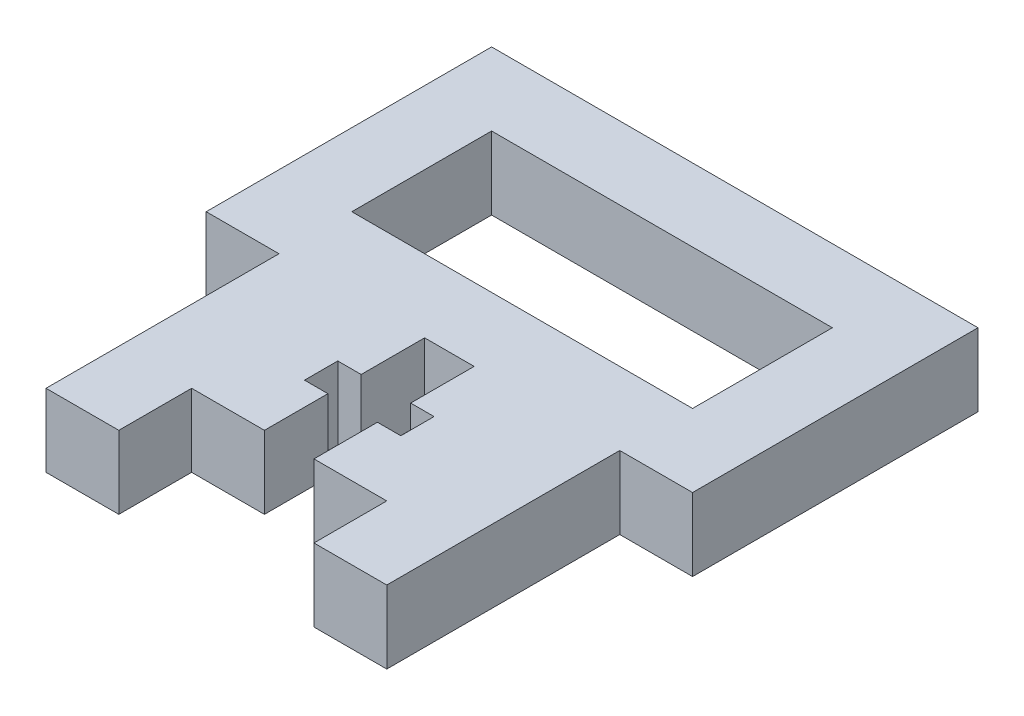
ISO-10303-21;
HEADER;
FILE_DESCRIPTION(('STEP AP214'),'2;1');
FILE_NAME('part.step','',(''),(''),'','','');
FILE_SCHEMA(('AUTOMOTIVE_DESIGN { 1 0 10303 214 1 1 1 1 }'));
ENDSEC;
DATA;
#1=APPLICATION_CONTEXT('core data for automotive mechanical design processes');
#2=APPLICATION_PROTOCOL_DEFINITION('international standard','automotive_design',2000,#1);
#3=PRODUCT_CONTEXT('',#1,'mechanical');
#4=PRODUCT('Part','Part','',(#3));
#5=PRODUCT_RELATED_PRODUCT_CATEGORY('part','',(#4));
#6=PRODUCT_DEFINITION_FORMATION('','',#4);
#7=PRODUCT_DEFINITION_CONTEXT('part definition',#1,'design');
#8=PRODUCT_DEFINITION('design','',#6,#7);
#9=PRODUCT_DEFINITION_SHAPE('','',#8);
#10=(LENGTH_UNIT() NAMED_UNIT(*) SI_UNIT(.MILLI.,.METRE.));
#11=(NAMED_UNIT(*) PLANE_ANGLE_UNIT() SI_UNIT($,.RADIAN.));
#12=(NAMED_UNIT(*) SI_UNIT($,.STERADIAN.) SOLID_ANGLE_UNIT());
#13=UNCERTAINTY_MEASURE_WITH_UNIT(LENGTH_MEASURE(1.E-05),#10,'distance_accuracy_value','');
#14=(GEOMETRIC_REPRESENTATION_CONTEXT(3) GLOBAL_UNCERTAINTY_ASSIGNED_CONTEXT((#13)) GLOBAL_UNIT_ASSIGNED_CONTEXT((#10,
#11,#12)) REPRESENTATION_CONTEXT('',''));
#15=CARTESIAN_POINT('',(0.,0.,0.));
#16=DIRECTION('',(0.,0.,1.));
#17=DIRECTION('',(1.,0.,0.));
#18=AXIS2_PLACEMENT_3D('',#15,#16,#17);
#19=CARTESIAN_POINT('',(0.,6.35,26.416));
#20=DIRECTION('',(0.,0.,1.));
#21=DIRECTION('',(1.,0.,0.));
#22=AXIS2_PLACEMENT_3D('',#19,#20,#21);
#23=PLANE('',#22);
#24=DIRECTION('',(-1.,0.,0.));
#25=VECTOR('',#24,1.);
#26=CARTESIAN_POINT('',(0.,0.,26.416));
#27=LINE('',#26,#25);
#28=CARTESIAN_POINT('',(8.509,0.,26.416));
#29=VERTEX_POINT('',#28);
#30=CARTESIAN_POINT('',(2.159,0.,26.416));
#31=VERTEX_POINT('',#30);
#32=EDGE_CURVE('E383',#29,#31,#27,.T.);
#33=ORIENTED_EDGE('',*,*,#32,.F.);
#34=DIRECTION('',(0.,-1.,0.));
#35=VECTOR('',#34,1.);
#36=CARTESIAN_POINT('',(8.509,6.35,26.416));
#37=LINE('',#36,#35);
#38=CARTESIAN_POINT('',(8.509,6.35,26.416));
#39=VERTEX_POINT('',#38);
#40=EDGE_CURVE('E11',#39,#29,#37,.T.);
#41=ORIENTED_EDGE('',*,*,#40,.F.);
#42=DIRECTION('',(-1.,0.,0.));
#43=VECTOR('',#42,1.);
#44=CARTESIAN_POINT('',(0.,6.35,26.416));
#45=LINE('',#44,#43);
#46=CARTESIAN_POINT('',(2.159,6.35,26.416));
#47=VERTEX_POINT('',#46);
#48=EDGE_CURVE('E453',#39,#47,#45,.T.);
#49=ORIENTED_EDGE('',*,*,#48,.T.);
#50=DIRECTION('',(0.,-1.,0.));
#51=VECTOR('',#50,1.);
#52=CARTESIAN_POINT('',(2.159,6.35,26.416));
#53=LINE('',#52,#51);
#54=EDGE_CURVE('E148',#47,#31,#53,.T.);
#55=ORIENTED_EDGE('',*,*,#54,.T.);
#56=EDGE_LOOP('',(#33,#41,#49,#55));
#57=FACE_BOUND('',#56,.T.);
#58=ADVANCED_FACE('F35',(#57),#23,.T.);
#59=CARTESIAN_POINT('',(8.50900000000001,6.35,0.));
#60=DIRECTION('',(1.,0.,0.));
#61=DIRECTION('',(0.,0.,-1.));
#62=AXIS2_PLACEMENT_3D('',#59,#60,#61);
#63=PLANE('',#62);
#64=DIRECTION('',(0.,0.,1.));
#65=VECTOR('',#64,1.);
#66=CARTESIAN_POINT('',(8.50900000000001,0.,0.));
#67=LINE('',#66,#65);
#68=CARTESIAN_POINT('',(8.509,0.,32.766));
#69=VERTEX_POINT('',#68);
#70=EDGE_CURVE('E380',#29,#69,#67,.T.);
#71=ORIENTED_EDGE('',*,*,#70,.T.);
#72=DIRECTION('',(0.,-1.,0.));
#73=VECTOR('',#72,1.);
#74=CARTESIAN_POINT('',(8.509,6.35,32.766));
#75=LINE('',#74,#73);
#76=CARTESIAN_POINT('',(8.509,6.35,32.766));
#77=VERTEX_POINT('',#76);
#78=EDGE_CURVE('E45',#77,#69,#75,.T.);
#79=ORIENTED_EDGE('',*,*,#78,.F.);
#80=DIRECTION('',(0.,0.,1.));
#81=VECTOR('',#80,1.);
#82=CARTESIAN_POINT('',(8.50900000000001,6.35,0.));
#83=LINE('',#82,#81);
#84=EDGE_CURVE('E450',#39,#77,#83,.T.);
#85=ORIENTED_EDGE('',*,*,#84,.F.);
#86=ORIENTED_EDGE('',*,*,#40,.T.);
#87=EDGE_LOOP('',(#71,#79,#85,#86));
#88=FACE_BOUND('',#87,.T.);
#89=ADVANCED_FACE('F479',(#88),#63,.F.);
#90=CARTESIAN_POINT('',(0.,6.35,32.766));
#91=DIRECTION('',(0.,0.,-1.));
#92=DIRECTION('',(-1.,0.,0.));
#93=AXIS2_PLACEMENT_3D('',#90,#91,#92);
#94=PLANE('',#93);
#95=DIRECTION('',(1.,0.,0.));
#96=VECTOR('',#95,1.);
#97=CARTESIAN_POINT('',(0.,0.,32.766));
#98=LINE('',#97,#96);
#99=CARTESIAN_POINT('',(14.859,0.,32.766));
#100=VERTEX_POINT('',#99);
#101=EDGE_CURVE('E377',#69,#100,#98,.T.);
#102=ORIENTED_EDGE('',*,*,#101,.T.);
#103=DIRECTION('',(0.,-1.,0.));
#104=VECTOR('',#103,1.);
#105=CARTESIAN_POINT('',(14.859,6.35,32.766));
#106=LINE('',#105,#104);
#107=CARTESIAN_POINT('',(14.859,6.35,32.766));
#108=VERTEX_POINT('',#107);
#109=EDGE_CURVE('E301',#108,#100,#106,.T.);
#110=ORIENTED_EDGE('',*,*,#109,.F.);
#111=DIRECTION('',(1.,0.,0.));
#112=VECTOR('',#111,1.);
#113=CARTESIAN_POINT('',(0.,6.35,32.766));
#114=LINE('',#113,#112);
#115=EDGE_CURVE('E447',#77,#108,#114,.T.);
#116=ORIENTED_EDGE('',*,*,#115,.F.);
#117=ORIENTED_EDGE('',*,*,#78,.T.);
#118=EDGE_LOOP('',(#102,#110,#116,#117));
#119=FACE_BOUND('',#118,.T.);
#120=ADVANCED_FACE('F483',(#119),#94,.F.);
#121=CARTESIAN_POINT('',(14.859,6.35,0.));
#122=DIRECTION('',(-1.,0.,0.));
#123=DIRECTION('',(0.,0.,1.));
#124=AXIS2_PLACEMENT_3D('',#121,#122,#123);
#125=PLANE('',#124);
#126=DIRECTION('',(0.,0.,-1.));
#127=VECTOR('',#126,1.);
#128=CARTESIAN_POINT('',(14.859,0.,0.));
#129=LINE('',#128,#127);
#130=CARTESIAN_POINT('',(14.859,0.,12.446));
#131=VERTEX_POINT('',#130);
#132=EDGE_CURVE('E374',#100,#131,#129,.T.);
#133=ORIENTED_EDGE('',*,*,#132,.T.);
#134=DIRECTION('',(0.,-1.,0.));
#135=VECTOR('',#134,1.);
#136=CARTESIAN_POINT('',(14.859,6.35,12.446));
#137=LINE('',#136,#135);
#138=CARTESIAN_POINT('',(14.859,6.35,12.446));
#139=VERTEX_POINT('',#138);
#140=EDGE_CURVE('E298',#139,#131,#137,.T.);
#141=ORIENTED_EDGE('',*,*,#140,.F.);
#142=DIRECTION('',(0.,0.,-1.));
#143=VECTOR('',#142,1.);
#144=CARTESIAN_POINT('',(14.859,6.35,0.));
#145=LINE('',#144,#143);
#146=EDGE_CURVE('E444',#108,#139,#145,.T.);
#147=ORIENTED_EDGE('',*,*,#146,.F.);
#148=ORIENTED_EDGE('',*,*,#109,.T.);
#149=EDGE_LOOP('',(#133,#141,#147,#148));
#150=FACE_BOUND('',#149,.T.);
#151=ADVANCED_FACE('F485',(#150),#125,.F.);
#152=CARTESIAN_POINT('',(0.,6.35,12.446));
#153=DIRECTION('',(0.,0.,-1.));
#154=DIRECTION('',(-1.,0.,0.));
#155=AXIS2_PLACEMENT_3D('',#152,#153,#154);
#156=PLANE('',#155);
#157=DIRECTION('',(1.,0.,0.));
#158=VECTOR('',#157,1.);
#159=CARTESIAN_POINT('',(0.,0.,12.446));
#160=LINE('',#159,#158);
#161=CARTESIAN_POINT('',(21.209,0.,12.446));
#162=VERTEX_POINT('',#161);
#163=EDGE_CURVE('E371',#131,#162,#160,.T.);
#164=ORIENTED_EDGE('',*,*,#163,.T.);
#165=DIRECTION('',(0.,-1.,0.));
#166=VECTOR('',#165,1.);
#167=CARTESIAN_POINT('',(21.209,6.35,12.446));
#168=LINE('',#167,#166);
#169=CARTESIAN_POINT('',(21.209,6.35,12.446));
#170=VERTEX_POINT('',#169);
#171=EDGE_CURVE('E295',#170,#162,#168,.T.);
#172=ORIENTED_EDGE('',*,*,#171,.F.);
#173=DIRECTION('',(1.,0.,0.));
#174=VECTOR('',#173,1.);
#175=CARTESIAN_POINT('',(0.,6.35,12.446));
#176=LINE('',#175,#174);
#177=EDGE_CURVE('E441',#139,#170,#176,.T.);
#178=ORIENTED_EDGE('',*,*,#177,.F.);
#179=ORIENTED_EDGE('',*,*,#140,.T.);
#180=EDGE_LOOP('',(#164,#172,#178,#179));
#181=FACE_BOUND('',#180,.T.);
#182=ADVANCED_FACE('F487',(#181),#156,.F.);
#183=CARTESIAN_POINT('',(21.209,6.35,0.));
#184=DIRECTION('',(-1.,0.,0.));
#185=DIRECTION('',(0.,0.,1.));
#186=AXIS2_PLACEMENT_3D('',#183,#184,#185);
#187=PLANE('',#186);
#188=DIRECTION('',(0.,0.,-1.));
#189=VECTOR('',#188,1.);
#190=CARTESIAN_POINT('',(21.209,0.,0.));
#191=LINE('',#190,#189);
#192=CARTESIAN_POINT('',(21.209,0.,-12.446));
#193=VERTEX_POINT('',#192);
#194=EDGE_CURVE('E368',#162,#193,#191,.T.);
#195=ORIENTED_EDGE('',*,*,#194,.T.);
#196=DIRECTION('',(0.,-1.,0.));
#197=VECTOR('',#196,1.);
#198=CARTESIAN_POINT('',(21.209,6.35,-12.446));
#199=LINE('',#198,#197);
#200=CARTESIAN_POINT('',(21.209,6.35,-12.446));
#201=VERTEX_POINT('',#200);
#202=EDGE_CURVE('E293',#201,#193,#199,.T.);
#203=ORIENTED_EDGE('',*,*,#202,.F.);
#204=DIRECTION('',(0.,0.,-1.));
#205=VECTOR('',#204,1.);
#206=CARTESIAN_POINT('',(21.209,6.35,0.));
#207=LINE('',#206,#205);
#208=EDGE_CURVE('E439',#170,#201,#207,.T.);
#209=ORIENTED_EDGE('',*,*,#208,.F.);
#210=ORIENTED_EDGE('',*,*,#171,.T.);
#211=EDGE_LOOP('',(#195,#203,#209,#210));
#212=FACE_BOUND('',#211,.T.);
#213=ADVANCED_FACE('F493',(#212),#187,.F.);
#214=CARTESIAN_POINT('',(0.,6.35,-12.446));
#215=DIRECTION('',(0.,0.,-1.));
#216=DIRECTION('',(-1.,0.,0.));
#217=AXIS2_PLACEMENT_3D('',#214,#215,#216);
#218=PLANE('',#217);
#219=DIRECTION('',(1.,0.,0.));
#220=VECTOR('',#219,1.);
#221=CARTESIAN_POINT('',(0.,0.,-12.446));
#222=LINE('',#221,#220);
#223=CARTESIAN_POINT('',(-21.209,0.,-12.446));
#224=VERTEX_POINT('',#223);
#225=EDGE_CURVE('E365',#224,#193,#222,.T.);
#226=ORIENTED_EDGE('',*,*,#225,.F.);
#227=DIRECTION('',(0.,-1.,0.));
#228=VECTOR('',#227,1.);
#229=CARTESIAN_POINT('',(-21.209,6.35,-12.446));
#230=LINE('',#229,#228);
#231=CARTESIAN_POINT('',(-21.209,6.35,-12.446));
#232=VERTEX_POINT('',#231);
#233=EDGE_CURVE('E291',#232,#224,#230,.T.);
#234=ORIENTED_EDGE('',*,*,#233,.F.);
#235=DIRECTION('',(1.,0.,0.));
#236=VECTOR('',#235,1.);
#237=CARTESIAN_POINT('',(0.,6.35,-12.446));
#238=LINE('',#237,#236);
#239=EDGE_CURVE('E436',#232,#201,#238,.T.);
#240=ORIENTED_EDGE('',*,*,#239,.T.);
#241=ORIENTED_EDGE('',*,*,#202,.T.);
#242=EDGE_LOOP('',(#226,#234,#240,#241));
#243=FACE_BOUND('',#242,.T.);
#244=ADVANCED_FACE('F496',(#243),#218,.T.);
#245=CARTESIAN_POINT('',(-21.209,6.35,0.));
#246=DIRECTION('',(-1.,0.,0.));
#247=DIRECTION('',(0.,0.,1.));
#248=AXIS2_PLACEMENT_3D('',#245,#246,#247);
#249=PLANE('',#248);
#250=DIRECTION('',(0.,0.,-1.));
#251=VECTOR('',#250,1.);
#252=CARTESIAN_POINT('',(-21.209,0.,0.));
#253=LINE('',#252,#251);
#254=CARTESIAN_POINT('',(-21.209,0.,12.446));
#255=VERTEX_POINT('',#254);
#256=EDGE_CURVE('E362',#255,#224,#253,.T.);
#257=ORIENTED_EDGE('',*,*,#256,.F.);
#258=DIRECTION('',(0.,-1.,0.));
#259=VECTOR('',#258,1.);
#260=CARTESIAN_POINT('',(-21.209,6.35,12.446));
#261=LINE('',#260,#259);
#262=CARTESIAN_POINT('',(-21.209,6.35,12.446));
#263=VERTEX_POINT('',#262);
#264=EDGE_CURVE('E289',#263,#255,#261,.T.);
#265=ORIENTED_EDGE('',*,*,#264,.F.);
#266=DIRECTION('',(0.,0.,-1.));
#267=VECTOR('',#266,1.);
#268=CARTESIAN_POINT('',(-21.209,6.35,0.));
#269=LINE('',#268,#267);
#270=EDGE_CURVE('E433',#263,#232,#269,.T.);
#271=ORIENTED_EDGE('',*,*,#270,.T.);
#272=ORIENTED_EDGE('',*,*,#233,.T.);
#273=EDGE_LOOP('',(#257,#265,#271,#272));
#274=FACE_BOUND('',#273,.T.);
#275=ADVANCED_FACE('F499',(#274),#249,.T.);
#276=CARTESIAN_POINT('',(0.,6.35,12.446));
#277=DIRECTION('',(0.,0.,1.));
#278=DIRECTION('',(1.,0.,0.));
#279=AXIS2_PLACEMENT_3D('',#276,#277,#278);
#280=PLANE('',#279);
#281=DIRECTION('',(-1.,0.,0.));
#282=VECTOR('',#281,1.);
#283=CARTESIAN_POINT('',(0.,0.,12.446));
#284=LINE('',#283,#282);
#285=CARTESIAN_POINT('',(-14.859,0.,12.446));
#286=VERTEX_POINT('',#285);
#287=EDGE_CURVE('E359',#286,#255,#284,.T.);
#288=ORIENTED_EDGE('',*,*,#287,.F.);
#289=DIRECTION('',(0.,-1.,0.));
#290=VECTOR('',#289,1.);
#291=CARTESIAN_POINT('',(-14.859,6.35,12.446));
#292=LINE('',#291,#290);
#293=CARTESIAN_POINT('',(-14.859,6.35,12.446));
#294=VERTEX_POINT('',#293);
#295=EDGE_CURVE('E287',#294,#286,#292,.T.);
#296=ORIENTED_EDGE('',*,*,#295,.F.);
#297=DIRECTION('',(-1.,0.,0.));
#298=VECTOR('',#297,1.);
#299=CARTESIAN_POINT('',(0.,6.35,12.446));
#300=LINE('',#299,#298);
#301=EDGE_CURVE('E430',#294,#263,#300,.T.);
#302=ORIENTED_EDGE('',*,*,#301,.T.);
#303=ORIENTED_EDGE('',*,*,#264,.T.);
#304=EDGE_LOOP('',(#288,#296,#302,#303));
#305=FACE_BOUND('',#304,.T.);
#306=ADVANCED_FACE('F504',(#305),#280,.T.);
#307=CARTESIAN_POINT('',(-14.859,6.35,0.));
#308=DIRECTION('',(-1.,0.,0.));
#309=DIRECTION('',(0.,0.,1.));
#310=AXIS2_PLACEMENT_3D('',#307,#308,#309);
#311=PLANE('',#310);
#312=DIRECTION('',(0.,0.,-1.));
#313=VECTOR('',#312,1.);
#314=CARTESIAN_POINT('',(-14.859,0.,0.));
#315=LINE('',#314,#313);
#316=CARTESIAN_POINT('',(-14.859,0.,32.766));
#317=VERTEX_POINT('',#316);
#318=EDGE_CURVE('E356',#317,#286,#315,.T.);
#319=ORIENTED_EDGE('',*,*,#318,.F.);
#320=DIRECTION('',(0.,-1.,0.));
#321=VECTOR('',#320,1.);
#322=CARTESIAN_POINT('',(-14.859,6.35,32.766));
#323=LINE('',#322,#321);
#324=CARTESIAN_POINT('',(-14.859,6.35,32.766));
#325=VERTEX_POINT('',#324);
#326=EDGE_CURVE('E285',#325,#317,#323,.T.);
#327=ORIENTED_EDGE('',*,*,#326,.F.);
#328=DIRECTION('',(0.,0.,-1.));
#329=VECTOR('',#328,1.);
#330=CARTESIAN_POINT('',(-14.859,6.35,0.));
#331=LINE('',#330,#329);
#332=EDGE_CURVE('E427',#325,#294,#331,.T.);
#333=ORIENTED_EDGE('',*,*,#332,.T.);
#334=ORIENTED_EDGE('',*,*,#295,.T.);
#335=EDGE_LOOP('',(#319,#327,#333,#334));
#336=FACE_BOUND('',#335,.T.);
#337=ADVANCED_FACE('F507',(#336),#311,.T.);
#338=CARTESIAN_POINT('',(0.,6.35,32.766));
#339=DIRECTION('',(0.,0.,1.));
#340=DIRECTION('',(1.,0.,0.));
#341=AXIS2_PLACEMENT_3D('',#338,#339,#340);
#342=PLANE('',#341);
#343=DIRECTION('',(-1.,0.,0.));
#344=VECTOR('',#343,1.);
#345=CARTESIAN_POINT('',(0.,0.,32.766));
#346=LINE('',#345,#344);
#347=CARTESIAN_POINT('',(-8.50899999999999,0.,32.766));
#348=VERTEX_POINT('',#347);
#349=EDGE_CURVE('E353',#348,#317,#346,.T.);
#350=ORIENTED_EDGE('',*,*,#349,.F.);
#351=DIRECTION('',(0.,-1.,0.));
#352=VECTOR('',#351,1.);
#353=CARTESIAN_POINT('',(-8.50899999999999,6.35,32.766));
#354=LINE('',#353,#352);
#355=CARTESIAN_POINT('',(-8.50899999999999,6.35,32.766));
#356=VERTEX_POINT('',#355);
#357=EDGE_CURVE('E283',#356,#348,#354,.T.);
#358=ORIENTED_EDGE('',*,*,#357,.F.);
#359=DIRECTION('',(-1.,0.,0.));
#360=VECTOR('',#359,1.);
#361=CARTESIAN_POINT('',(0.,6.35,32.766));
#362=LINE('',#361,#360);
#363=EDGE_CURVE('E424',#356,#325,#362,.T.);
#364=ORIENTED_EDGE('',*,*,#363,.T.);
#365=ORIENTED_EDGE('',*,*,#326,.T.);
#366=EDGE_LOOP('',(#350,#358,#364,#365));
#367=FACE_BOUND('',#366,.T.);
#368=ADVANCED_FACE('F512',(#367),#342,.T.);
#369=CARTESIAN_POINT('',(-8.50900000000001,6.35,0.));
#370=DIRECTION('',(1.,0.,0.));
#371=DIRECTION('',(0.,0.,-1.));
#372=AXIS2_PLACEMENT_3D('',#369,#370,#371);
#373=PLANE('',#372);
#374=DIRECTION('',(0.,0.,1.));
#375=VECTOR('',#374,1.);
#376=CARTESIAN_POINT('',(-8.50900000000001,0.,0.));
#377=LINE('',#376,#375);
#378=CARTESIAN_POINT('',(-8.509,0.,26.416));
#379=VERTEX_POINT('',#378);
#380=EDGE_CURVE('E350',#379,#348,#377,.T.);
#381=ORIENTED_EDGE('',*,*,#380,.F.);
#382=DIRECTION('',(0.,-1.,0.));
#383=VECTOR('',#382,1.);
#384=CARTESIAN_POINT('',(-8.509,6.35,26.416));
#385=LINE('',#384,#383);
#386=CARTESIAN_POINT('',(-8.509,6.35,26.416));
#387=VERTEX_POINT('',#386);
#388=EDGE_CURVE('E281',#387,#379,#385,.T.);
#389=ORIENTED_EDGE('',*,*,#388,.F.);
#390=DIRECTION('',(0.,0.,1.));
#391=VECTOR('',#390,1.);
#392=CARTESIAN_POINT('',(-8.50900000000001,6.35,0.));
#393=LINE('',#392,#391);
#394=EDGE_CURVE('E421',#387,#356,#393,.T.);
#395=ORIENTED_EDGE('',*,*,#394,.T.);
#396=ORIENTED_EDGE('',*,*,#357,.T.);
#397=EDGE_LOOP('',(#381,#389,#395,#396));
#398=FACE_BOUND('',#397,.T.);
#399=ADVANCED_FACE('F515',(#398),#373,.T.);
#400=CARTESIAN_POINT('',(0.,6.35,26.416));
#401=DIRECTION('',(0.,0.,-1.));
#402=DIRECTION('',(-1.,0.,0.));
#403=AXIS2_PLACEMENT_3D('',#400,#401,#402);
#404=PLANE('',#403);
#405=DIRECTION('',(1.,0.,0.));
#406=VECTOR('',#405,1.);
#407=CARTESIAN_POINT('',(0.,0.,26.416));
#408=LINE('',#407,#406);
#409=CARTESIAN_POINT('',(-2.159,0.,26.416));
#410=VERTEX_POINT('',#409);
#411=EDGE_CURVE('E347',#379,#410,#408,.T.);
#412=ORIENTED_EDGE('',*,*,#411,.T.);
#413=DIRECTION('',(0.,-1.,0.));
#414=VECTOR('',#413,1.);
#415=CARTESIAN_POINT('',(-2.159,6.35,26.416));
#416=LINE('',#415,#414);
#417=CARTESIAN_POINT('',(-2.159,6.35,26.416));
#418=VERTEX_POINT('',#417);
#419=EDGE_CURVE('E278',#418,#410,#416,.T.);
#420=ORIENTED_EDGE('',*,*,#419,.F.);
#421=DIRECTION('',(1.,0.,0.));
#422=VECTOR('',#421,1.);
#423=CARTESIAN_POINT('',(0.,6.35,26.416));
#424=LINE('',#423,#422);
#425=EDGE_CURVE('E418',#387,#418,#424,.T.);
#426=ORIENTED_EDGE('',*,*,#425,.F.);
#427=ORIENTED_EDGE('',*,*,#388,.T.);
#428=EDGE_LOOP('',(#412,#420,#426,#427));
#429=FACE_BOUND('',#428,.T.);
#430=ADVANCED_FACE('F520',(#429),#404,.F.);
#431=CARTESIAN_POINT('',(-2.15899999999998,6.35,0.));
#432=DIRECTION('',(-1.,0.,0.));
#433=DIRECTION('',(0.,0.,1.));
#434=AXIS2_PLACEMENT_3D('',#431,#432,#433);
#435=PLANE('',#434);
#436=DIRECTION('',(0.,0.,-1.));
#437=VECTOR('',#436,1.);
#438=CARTESIAN_POINT('',(-2.15899999999998,0.,0.));
#439=LINE('',#438,#437);
#440=CARTESIAN_POINT('',(-2.15899999999999,0.,20.881000021));
#441=VERTEX_POINT('',#440);
#442=EDGE_CURVE('E344',#410,#441,#439,.T.);
#443=ORIENTED_EDGE('',*,*,#442,.T.);
#444=DIRECTION('',(0.,-1.,0.));
#445=VECTOR('',#444,1.);
#446=CARTESIAN_POINT('',(-2.15899999999999,6.35,20.881000021));
#447=LINE('',#446,#445);
#448=CARTESIAN_POINT('',(-2.15899999999999,6.35,20.881000021));
#449=VERTEX_POINT('',#448);
#450=EDGE_CURVE('E275',#449,#441,#447,.T.);
#451=ORIENTED_EDGE('',*,*,#450,.F.);
#452=DIRECTION('',(0.,0.,-1.));
#453=VECTOR('',#452,1.);
#454=CARTESIAN_POINT('',(-2.15899999999998,6.35,0.));
#455=LINE('',#454,#453);
#456=EDGE_CURVE('E415',#418,#449,#455,.T.);
#457=ORIENTED_EDGE('',*,*,#456,.F.);
#458=ORIENTED_EDGE('',*,*,#419,.T.);
#459=EDGE_LOOP('',(#443,#451,#457,#458));
#460=FACE_BOUND('',#459,.T.);
#461=ADVANCED_FACE('F523',(#460),#435,.F.);
#462=CARTESIAN_POINT('',(0.,6.35,20.881000021));
#463=DIRECTION('',(0.,0.,1.));
#464=DIRECTION('',(1.,0.,0.));
#465=AXIS2_PLACEMENT_3D('',#462,#463,#464);
#466=PLANE('',#465);
#467=DIRECTION('',(-1.,0.,0.));
#468=VECTOR('',#467,1.);
#469=CARTESIAN_POINT('',(0.,0.,20.881000021));
#470=LINE('',#469,#468);
#471=CARTESIAN_POINT('',(-4.199999982,0.,20.881000021));
#472=VERTEX_POINT('',#471);
#473=EDGE_CURVE('E341',#441,#472,#470,.T.);
#474=ORIENTED_EDGE('',*,*,#473,.T.);
#475=DIRECTION('',(0.,-1.,0.));
#476=VECTOR('',#475,1.);
#477=CARTESIAN_POINT('',(-4.199999982,6.35,20.881000021));
#478=LINE('',#477,#476);
#479=CARTESIAN_POINT('',(-4.199999982,6.35,20.881000021));
#480=VERTEX_POINT('',#479);
#481=EDGE_CURVE('E272',#480,#472,#478,.T.);
#482=ORIENTED_EDGE('',*,*,#481,.F.);
#483=DIRECTION('',(-1.,0.,0.));
#484=VECTOR('',#483,1.);
#485=CARTESIAN_POINT('',(0.,6.35,20.881000021));
#486=LINE('',#485,#484);
#487=EDGE_CURVE('E412',#449,#480,#486,.T.);
#488=ORIENTED_EDGE('',*,*,#487,.F.);
#489=ORIENTED_EDGE('',*,*,#450,.T.);
#490=EDGE_LOOP('',(#474,#482,#488,#489));
#491=FACE_BOUND('',#490,.T.);
#492=ADVANCED_FACE('F525',(#491),#466,.F.);
#493=CARTESIAN_POINT('',(-4.19999998199997,6.35,0.));
#494=DIRECTION('',(-1.,0.,0.));
#495=DIRECTION('',(0.,0.,1.));
#496=AXIS2_PLACEMENT_3D('',#493,#494,#495);
#497=PLANE('',#496);
#498=DIRECTION('',(0.,0.,-1.));
#499=VECTOR('',#498,1.);
#500=CARTESIAN_POINT('',(-4.19999998199997,0.,0.));
#501=LINE('',#500,#499);
#502=CARTESIAN_POINT('',(-4.19999998199999,0.,17.980999979));
#503=VERTEX_POINT('',#502);
#504=EDGE_CURVE('E338',#472,#503,#501,.T.);
#505=ORIENTED_EDGE('',*,*,#504,.T.);
#506=DIRECTION('',(0.,-1.,0.));
#507=VECTOR('',#506,1.);
#508=CARTESIAN_POINT('',(-4.19999998199999,6.35,17.980999979));
#509=LINE('',#508,#507);
#510=CARTESIAN_POINT('',(-4.19999998199999,6.35,17.980999979));
#511=VERTEX_POINT('',#510);
#512=EDGE_CURVE('E269',#511,#503,#509,.T.);
#513=ORIENTED_EDGE('',*,*,#512,.F.);
#514=DIRECTION('',(0.,0.,-1.));
#515=VECTOR('',#514,1.);
#516=CARTESIAN_POINT('',(-4.19999998199997,6.35,0.));
#517=LINE('',#516,#515);
#518=EDGE_CURVE('E409',#480,#511,#517,.T.);
#519=ORIENTED_EDGE('',*,*,#518,.F.);
#520=ORIENTED_EDGE('',*,*,#481,.T.);
#521=EDGE_LOOP('',(#505,#513,#519,#520));
#522=FACE_BOUND('',#521,.T.);
#523=ADVANCED_FACE('F530',(#522),#497,.F.);
#524=CARTESIAN_POINT('',(0.,6.35,17.980999979));
#525=DIRECTION('',(0.,0.,-1.));
#526=DIRECTION('',(-1.,0.,0.));
#527=AXIS2_PLACEMENT_3D('',#524,#525,#526);
#528=PLANE('',#527);
#529=DIRECTION('',(1.,0.,0.));
#530=VECTOR('',#529,1.);
#531=CARTESIAN_POINT('',(0.,0.,17.980999979));
#532=LINE('',#531,#530);
#533=CARTESIAN_POINT('',(-2.15899999999999,0.,17.980999979));
#534=VERTEX_POINT('',#533);
#535=EDGE_CURVE('E335',#503,#534,#532,.T.);
#536=ORIENTED_EDGE('',*,*,#535,.T.);
#537=DIRECTION('',(0.,-1.,0.));
#538=VECTOR('',#537,1.);
#539=CARTESIAN_POINT('',(-2.15899999999999,6.35,17.980999979));
#540=LINE('',#539,#538);
#541=CARTESIAN_POINT('',(-2.15899999999999,6.35,17.980999979));
#542=VERTEX_POINT('',#541);
#543=EDGE_CURVE('E266',#542,#534,#540,.T.);
#544=ORIENTED_EDGE('',*,*,#543,.F.);
#545=DIRECTION('',(1.,0.,0.));
#546=VECTOR('',#545,1.);
#547=CARTESIAN_POINT('',(0.,6.35,17.980999979));
#548=LINE('',#547,#546);
#549=EDGE_CURVE('E406',#511,#542,#548,.T.);
#550=ORIENTED_EDGE('',*,*,#549,.F.);
#551=ORIENTED_EDGE('',*,*,#512,.T.);
#552=EDGE_LOOP('',(#536,#544,#550,#551));
#553=FACE_BOUND('',#552,.T.);
#554=ADVANCED_FACE('F532',(#553),#528,.F.);
#555=CARTESIAN_POINT('',(-2.15899999999999,6.35,0.));
#556=DIRECTION('',(-1.,0.,0.));
#557=DIRECTION('',(0.,0.,1.));
#558=AXIS2_PLACEMENT_3D('',#555,#556,#557);
#559=PLANE('',#558);
#560=DIRECTION('',(0.,0.,-1.));
#561=VECTOR('',#560,1.);
#562=CARTESIAN_POINT('',(-2.15899999999999,0.,0.));
#563=LINE('',#562,#561);
#564=CARTESIAN_POINT('',(-2.15899999999999,0.,12.446));
#565=VERTEX_POINT('',#564);
#566=EDGE_CURVE('E332',#534,#565,#563,.T.);
#567=ORIENTED_EDGE('',*,*,#566,.T.);
#568=DIRECTION('',(0.,-1.,0.));
#569=VECTOR('',#568,1.);
#570=CARTESIAN_POINT('',(-2.15899999999999,6.35,12.446));
#571=LINE('',#570,#569);
#572=CARTESIAN_POINT('',(-2.15899999999999,6.35,12.446));
#573=VERTEX_POINT('',#572);
#574=EDGE_CURVE('E263',#573,#565,#571,.T.);
#575=ORIENTED_EDGE('',*,*,#574,.F.);
#576=DIRECTION('',(0.,0.,-1.));
#577=VECTOR('',#576,1.);
#578=CARTESIAN_POINT('',(-2.15899999999999,6.35,0.));
#579=LINE('',#578,#577);
#580=EDGE_CURVE('E403',#542,#573,#579,.T.);
#581=ORIENTED_EDGE('',*,*,#580,.F.);
#582=ORIENTED_EDGE('',*,*,#543,.T.);
#583=EDGE_LOOP('',(#567,#575,#581,#582));
#584=FACE_BOUND('',#583,.T.);
#585=ADVANCED_FACE('F534',(#584),#559,.F.);
#586=CARTESIAN_POINT('',(0.,6.35,12.446));
#587=DIRECTION('',(0.,0.,-1.));
#588=DIRECTION('',(-1.,0.,0.));
#589=AXIS2_PLACEMENT_3D('',#586,#587,#588);
#590=PLANE('',#589);
#591=DIRECTION('',(1.,0.,0.));
#592=VECTOR('',#591,1.);
#593=CARTESIAN_POINT('',(0.,0.,12.446));
#594=LINE('',#593,#592);
#595=CARTESIAN_POINT('',(2.159,0.,12.446));
#596=VERTEX_POINT('',#595);
#597=EDGE_CURVE('E329',#565,#596,#594,.T.);
#598=ORIENTED_EDGE('',*,*,#597,.T.);
#599=DIRECTION('',(0.,-1.,0.));
#600=VECTOR('',#599,1.);
#601=CARTESIAN_POINT('',(2.159,6.35,12.446));
#602=LINE('',#601,#600);
#603=CARTESIAN_POINT('',(2.159,6.35,12.446));
#604=VERTEX_POINT('',#603);
#605=EDGE_CURVE('E260',#604,#596,#602,.T.);
#606=ORIENTED_EDGE('',*,*,#605,.F.);
#607=DIRECTION('',(1.,0.,0.));
#608=VECTOR('',#607,1.);
#609=CARTESIAN_POINT('',(0.,6.35,12.446));
#610=LINE('',#609,#608);
#611=EDGE_CURVE('E400',#573,#604,#610,.T.);
#612=ORIENTED_EDGE('',*,*,#611,.F.);
#613=ORIENTED_EDGE('',*,*,#574,.T.);
#614=EDGE_LOOP('',(#598,#606,#612,#613));
#615=FACE_BOUND('',#614,.T.);
#616=ADVANCED_FACE('F539',(#615),#590,.F.);
#617=CARTESIAN_POINT('',(2.15899999999998,6.35,0.));
#618=DIRECTION('',(1.,0.,0.));
#619=DIRECTION('',(0.,0.,-1.));
#620=AXIS2_PLACEMENT_3D('',#617,#618,#619);
#621=PLANE('',#620);
#622=DIRECTION('',(0.,0.,1.));
#623=VECTOR('',#622,1.);
#624=CARTESIAN_POINT('',(2.15899999999998,0.,0.));
#625=LINE('',#624,#623);
#626=CARTESIAN_POINT('',(2.159,0.,17.980999979));
#627=VERTEX_POINT('',#626);
#628=EDGE_CURVE('E326',#596,#627,#625,.T.);
#629=ORIENTED_EDGE('',*,*,#628,.T.);
#630=DIRECTION('',(0.,-1.,0.));
#631=VECTOR('',#630,1.);
#632=CARTESIAN_POINT('',(2.159,6.35,17.980999979));
#633=LINE('',#632,#631);
#634=CARTESIAN_POINT('',(2.159,6.35,17.980999979));
#635=VERTEX_POINT('',#634);
#636=EDGE_CURVE('E253',#635,#627,#633,.T.);
#637=ORIENTED_EDGE('',*,*,#636,.F.);
#638=DIRECTION('',(0.,0.,1.));
#639=VECTOR('',#638,1.);
#640=CARTESIAN_POINT('',(2.15899999999998,6.35,0.));
#641=LINE('',#640,#639);
#642=EDGE_CURVE('E398',#604,#635,#641,.T.);
#643=ORIENTED_EDGE('',*,*,#642,.F.);
#644=ORIENTED_EDGE('',*,*,#605,.T.);
#645=EDGE_LOOP('',(#629,#637,#643,#644));
#646=FACE_BOUND('',#645,.T.);
#647=ADVANCED_FACE('F541',(#646),#621,.F.);
#648=CARTESIAN_POINT('',(0.,6.35,17.980999979));
#649=DIRECTION('',(0.,0.,-1.));
#650=DIRECTION('',(-1.,0.,0.));
#651=AXIS2_PLACEMENT_3D('',#648,#649,#650);
#652=PLANE('',#651);
#653=DIRECTION('',(1.,0.,0.));
#654=VECTOR('',#653,1.);
#655=CARTESIAN_POINT('',(0.,0.,17.980999979));
#656=LINE('',#655,#654);
#657=CARTESIAN_POINT('',(4.199999982,0.,17.980999979));
#658=VERTEX_POINT('',#657);
#659=EDGE_CURVE('E323',#627,#658,#656,.T.);
#660=ORIENTED_EDGE('',*,*,#659,.T.);
#661=DIRECTION('',(0.,-1.,0.));
#662=VECTOR('',#661,1.);
#663=CARTESIAN_POINT('',(4.199999982,6.35,17.980999979));
#664=LINE('',#663,#662);
#665=CARTESIAN_POINT('',(4.199999982,6.35,17.980999979));
#666=VERTEX_POINT('',#665);
#667=EDGE_CURVE('E251',#666,#658,#664,.T.);
#668=ORIENTED_EDGE('',*,*,#667,.F.);
#669=DIRECTION('',(1.,0.,0.));
#670=VECTOR('',#669,1.);
#671=CARTESIAN_POINT('',(0.,6.35,17.980999979));
#672=LINE('',#671,#670);
#673=EDGE_CURVE('E244',#635,#666,#672,.T.);
#674=ORIENTED_EDGE('',*,*,#673,.F.);
#675=ORIENTED_EDGE('',*,*,#636,.T.);
#676=EDGE_LOOP('',(#660,#668,#674,#675));
#677=FACE_BOUND('',#676,.T.);
#678=ADVANCED_FACE('F543',(#677),#652,.F.);
#679=CARTESIAN_POINT('',(4.19999998199992,6.35,0.));
#680=DIRECTION('',(1.,0.,0.));
#681=DIRECTION('',(0.,0.,-1.));
#682=AXIS2_PLACEMENT_3D('',#679,#680,#681);
#683=PLANE('',#682);
#684=DIRECTION('',(0.,0.,1.));
#685=VECTOR('',#684,1.);
#686=CARTESIAN_POINT('',(4.19999998199992,0.,0.));
#687=LINE('',#686,#685);
#688=CARTESIAN_POINT('',(4.19999998200001,0.,20.881000021));
#689=VERTEX_POINT('',#688);
#690=EDGE_CURVE('E250',#658,#689,#687,.T.);
#691=ORIENTED_EDGE('',*,*,#690,.T.);
#692=DIRECTION('',(0.,-1.,0.));
#693=VECTOR('',#692,1.);
#694=CARTESIAN_POINT('',(4.19999998200001,6.35,20.881000021));
#695=LINE('',#694,#693);
#696=CARTESIAN_POINT('',(4.19999998200001,6.35,20.881000021));
#697=VERTEX_POINT('',#696);
#698=EDGE_CURVE('E236',#697,#689,#695,.T.);
#699=ORIENTED_EDGE('',*,*,#698,.F.);
#700=DIRECTION('',(0.,0.,1.));
#701=VECTOR('',#700,1.);
#702=CARTESIAN_POINT('',(4.19999998199992,6.35,0.));
#703=LINE('',#702,#701);
#704=EDGE_CURVE('E239',#666,#697,#703,.T.);
#705=ORIENTED_EDGE('',*,*,#704,.F.);
#706=ORIENTED_EDGE('',*,*,#667,.T.);
#707=EDGE_LOOP('',(#691,#699,#705,#706));
#708=FACE_BOUND('',#707,.T.);
#709=ADVANCED_FACE('F249',(#708),#683,.F.);
#710=CARTESIAN_POINT('',(0.,6.35,20.881000021));
#711=DIRECTION('',(0.,0.,1.));
#712=DIRECTION('',(1.,0.,0.));
#713=AXIS2_PLACEMENT_3D('',#710,#711,#712);
#714=PLANE('',#713);
#715=DIRECTION('',(-1.,0.,0.));
#716=VECTOR('',#715,1.);
#717=CARTESIAN_POINT('',(0.,0.,20.881000021));
#718=LINE('',#717,#716);
#719=CARTESIAN_POINT('',(2.159,0.,20.881000021));
#720=VERTEX_POINT('',#719);
#721=EDGE_CURVE('E320',#689,#720,#718,.T.);
#722=ORIENTED_EDGE('',*,*,#721,.T.);
#723=DIRECTION('',(0.,-1.,0.));
#724=VECTOR('',#723,1.);
#725=CARTESIAN_POINT('',(2.159,6.35,20.881000021));
#726=LINE('',#725,#724);
#727=CARTESIAN_POINT('',(2.159,6.35,20.881000021));
#728=VERTEX_POINT('',#727);
#729=EDGE_CURVE('E238',#728,#720,#726,.T.);
#730=ORIENTED_EDGE('',*,*,#729,.F.);
#731=DIRECTION('',(-1.,0.,0.));
#732=VECTOR('',#731,1.);
#733=CARTESIAN_POINT('',(0.,6.35,20.881000021));
#734=LINE('',#733,#732);
#735=EDGE_CURVE('E231',#697,#728,#734,.T.);
#736=ORIENTED_EDGE('',*,*,#735,.F.);
#737=ORIENTED_EDGE('',*,*,#698,.T.);
#738=EDGE_LOOP('',(#722,#730,#736,#737));
#739=FACE_BOUND('',#738,.T.);
#740=ADVANCED_FACE('F234',(#739),#714,.F.);
#741=CARTESIAN_POINT('',(14.859,6.35,0.));
#742=DIRECTION('',(-1.,0.,0.));
#743=DIRECTION('',(0.,0.,1.));
#744=AXIS2_PLACEMENT_3D('',#741,#742,#743);
#745=PLANE('',#744);
#746=DIRECTION('',(0.,0.,-1.));
#747=VECTOR('',#746,1.);
#748=CARTESIAN_POINT('',(14.859,0.,0.));
#749=LINE('',#748,#747);
#750=CARTESIAN_POINT('',(14.859,0.,6.096));
#751=VERTEX_POINT('',#750);
#752=CARTESIAN_POINT('',(14.859,0.,-6.096));
#753=VERTEX_POINT('',#752);
#754=EDGE_CURVE('E393',#751,#753,#749,.T.);
#755=ORIENTED_EDGE('',*,*,#754,.F.);
#756=DIRECTION('',(0.,-1.,0.));
#757=VECTOR('',#756,1.);
#758=CARTESIAN_POINT('',(14.859,6.35,6.096));
#759=LINE('',#758,#757);
#760=CARTESIAN_POINT('',(14.859,6.35,6.096));
#761=VERTEX_POINT('',#760);
#762=EDGE_CURVE('E39',#761,#751,#759,.T.);
#763=ORIENTED_EDGE('',*,*,#762,.F.);
#764=DIRECTION('',(0.,0.,-1.));
#765=VECTOR('',#764,1.);
#766=CARTESIAN_POINT('',(14.859,6.35,0.));
#767=LINE('',#766,#765);
#768=CARTESIAN_POINT('',(14.859,6.35,-6.096));
#769=VERTEX_POINT('',#768);
#770=EDGE_CURVE('E319',#761,#769,#767,.T.);
#771=ORIENTED_EDGE('',*,*,#770,.T.);
#772=DIRECTION('',(0.,-1.,0.));
#773=VECTOR('',#772,1.);
#774=CARTESIAN_POINT('',(14.859,6.35,-6.096));
#775=LINE('',#774,#773);
#776=EDGE_CURVE('E306',#769,#753,#775,.T.);
#777=ORIENTED_EDGE('',*,*,#776,.T.);
#778=EDGE_LOOP('',(#755,#763,#771,#777));
#779=FACE_BOUND('',#778,.T.);
#780=ADVANCED_FACE('F37',(#779),#745,.T.);
#781=CARTESIAN_POINT('',(0.,6.35,6.096));
#782=DIRECTION('',(0.,0.,-1.));
#783=DIRECTION('',(-1.,0.,0.));
#784=AXIS2_PLACEMENT_3D('',#781,#782,#783);
#785=PLANE('',#784);
#786=DIRECTION('',(1.,0.,0.));
#787=VECTOR('',#786,1.);
#788=CARTESIAN_POINT('',(0.,0.,6.096));
#789=LINE('',#788,#787);
#790=CARTESIAN_POINT('',(-14.859,0.,6.096));
#791=VERTEX_POINT('',#790);
#792=EDGE_CURVE('E390',#791,#751,#789,.T.);
#793=ORIENTED_EDGE('',*,*,#792,.F.);
#794=DIRECTION('',(0.,-1.,0.));
#795=VECTOR('',#794,1.);
#796=CARTESIAN_POINT('',(-14.859,6.35,6.096));
#797=LINE('',#796,#795);
#798=CARTESIAN_POINT('',(-14.859,6.35,6.096));
#799=VERTEX_POINT('',#798);
#800=EDGE_CURVE('E310',#799,#791,#797,.T.);
#801=ORIENTED_EDGE('',*,*,#800,.F.);
#802=DIRECTION('',(1.,0.,0.));
#803=VECTOR('',#802,1.);
#804=CARTESIAN_POINT('',(0.,6.35,6.096));
#805=LINE('',#804,#803);
#806=EDGE_CURVE('E459',#799,#761,#805,.T.);
#807=ORIENTED_EDGE('',*,*,#806,.T.);
#808=ORIENTED_EDGE('',*,*,#762,.T.);
#809=EDGE_LOOP('',(#793,#801,#807,#808));
#810=FACE_BOUND('',#809,.T.);
#811=ADVANCED_FACE('F465',(#810),#785,.T.);
#812=CARTESIAN_POINT('',(-14.859,6.35,0.));
#813=DIRECTION('',(-1.,0.,0.));
#814=DIRECTION('',(0.,0.,1.));
#815=AXIS2_PLACEMENT_3D('',#812,#813,#814);
#816=PLANE('',#815);
#817=DIRECTION('',(0.,0.,-1.));
#818=VECTOR('',#817,1.);
#819=CARTESIAN_POINT('',(-14.859,0.,0.));
#820=LINE('',#819,#818);
#821=CARTESIAN_POINT('',(-14.859,0.,-6.096));
#822=VERTEX_POINT('',#821);
#823=EDGE_CURVE('E388',#791,#822,#820,.T.);
#824=ORIENTED_EDGE('',*,*,#823,.T.);
#825=DIRECTION('',(0.,-1.,0.));
#826=VECTOR('',#825,1.);
#827=CARTESIAN_POINT('',(-14.859,6.35,-6.096));
#828=LINE('',#827,#826);
#829=CARTESIAN_POINT('',(-14.859,6.35,-6.096));
#830=VERTEX_POINT('',#829);
#831=EDGE_CURVE('E308',#830,#822,#828,.T.);
#832=ORIENTED_EDGE('',*,*,#831,.F.);
#833=DIRECTION('',(0.,0.,-1.));
#834=VECTOR('',#833,1.);
#835=CARTESIAN_POINT('',(-14.859,6.35,0.));
#836=LINE('',#835,#834);
#837=EDGE_CURVE('E457',#799,#830,#836,.T.);
#838=ORIENTED_EDGE('',*,*,#837,.F.);
#839=ORIENTED_EDGE('',*,*,#800,.T.);
#840=EDGE_LOOP('',(#824,#832,#838,#839));
#841=FACE_BOUND('',#840,.T.);
#842=ADVANCED_FACE('F467',(#841),#816,.F.);
#843=CARTESIAN_POINT('',(0.,6.35,-6.096));
#844=DIRECTION('',(0.,0.,-1.));
#845=DIRECTION('',(-1.,0.,0.));
#846=AXIS2_PLACEMENT_3D('',#843,#844,#845);
#847=PLANE('',#846);
#848=DIRECTION('',(1.,0.,0.));
#849=VECTOR('',#848,1.);
#850=CARTESIAN_POINT('',(0.,0.,-6.096));
#851=LINE('',#850,#849);
#852=EDGE_CURVE('E385',#822,#753,#851,.T.);
#853=ORIENTED_EDGE('',*,*,#852,.T.);
#854=ORIENTED_EDGE('',*,*,#776,.F.);
#855=DIRECTION('',(1.,0.,0.));
#856=VECTOR('',#855,1.);
#857=CARTESIAN_POINT('',(0.,6.35,-6.096));
#858=LINE('',#857,#856);
#859=EDGE_CURVE('E455',#830,#769,#858,.T.);
#860=ORIENTED_EDGE('',*,*,#859,.F.);
#861=ORIENTED_EDGE('',*,*,#831,.T.);
#862=EDGE_LOOP('',(#853,#854,#860,#861));
#863=FACE_BOUND('',#862,.T.);
#864=ADVANCED_FACE('F470',(#863),#847,.F.);
#865=CARTESIAN_POINT('',(2.15900000000002,6.35,0.));
#866=DIRECTION('',(1.,0.,0.));
#867=DIRECTION('',(0.,0.,-1.));
#868=AXIS2_PLACEMENT_3D('',#865,#866,#867);
#869=PLANE('',#868);
#870=DIRECTION('',(0.,0.,1.));
#871=VECTOR('',#870,1.);
#872=CARTESIAN_POINT('',(2.15900000000002,0.,0.));
#873=LINE('',#872,#871);
#874=EDGE_CURVE('E141',#720,#31,#873,.T.);
#875=ORIENTED_EDGE('',*,*,#874,.T.);
#876=ORIENTED_EDGE('',*,*,#54,.F.);
#877=DIRECTION('',(0.,0.,1.));
#878=VECTOR('',#877,1.);
#879=CARTESIAN_POINT('',(2.15900000000002,6.35,0.));
#880=LINE('',#879,#878);
#881=EDGE_CURVE('E54',#728,#47,#880,.T.);
#882=ORIENTED_EDGE('',*,*,#881,.F.);
#883=ORIENTED_EDGE('',*,*,#729,.T.);
#884=EDGE_LOOP('',(#875,#876,#882,#883));
#885=FACE_BOUND('',#884,.T.);
#886=ADVANCED_FACE('F562',(#885),#869,.F.);
#887=CARTESIAN_POINT('',(0.,6.35,0.));
#888=DIRECTION('',(0.,1.,0.));
#889=DIRECTION('',(0.,0.,1.));
#890=AXIS2_PLACEMENT_3D('',#887,#888,#889);
#891=PLANE('',#890);
#892=ORIENTED_EDGE('',*,*,#770,.F.);
#893=ORIENTED_EDGE('',*,*,#806,.F.);
#894=ORIENTED_EDGE('',*,*,#837,.T.);
#895=ORIENTED_EDGE('',*,*,#859,.T.);
#896=EDGE_LOOP('',(#892,#893,#894,#895));
#897=FACE_BOUND('',#896,.T.);
#898=ORIENTED_EDGE('',*,*,#48,.F.);
#899=ORIENTED_EDGE('',*,*,#84,.T.);
#900=ORIENTED_EDGE('',*,*,#115,.T.);
#901=ORIENTED_EDGE('',*,*,#146,.T.);
#902=ORIENTED_EDGE('',*,*,#177,.T.);
#903=ORIENTED_EDGE('',*,*,#208,.T.);
#904=ORIENTED_EDGE('',*,*,#239,.F.);
#905=ORIENTED_EDGE('',*,*,#270,.F.);
#906=ORIENTED_EDGE('',*,*,#301,.F.);
#907=ORIENTED_EDGE('',*,*,#332,.F.);
#908=ORIENTED_EDGE('',*,*,#363,.F.);
#909=ORIENTED_EDGE('',*,*,#394,.F.);
#910=ORIENTED_EDGE('',*,*,#425,.T.);
#911=ORIENTED_EDGE('',*,*,#456,.T.);
#912=ORIENTED_EDGE('',*,*,#487,.T.);
#913=ORIENTED_EDGE('',*,*,#518,.T.);
#914=ORIENTED_EDGE('',*,*,#549,.T.);
#915=ORIENTED_EDGE('',*,*,#580,.T.);
#916=ORIENTED_EDGE('',*,*,#611,.T.);
#917=ORIENTED_EDGE('',*,*,#642,.T.);
#918=ORIENTED_EDGE('',*,*,#673,.T.);
#919=ORIENTED_EDGE('',*,*,#704,.T.);
#920=ORIENTED_EDGE('',*,*,#735,.T.);
#921=ORIENTED_EDGE('',*,*,#881,.T.);
#922=EDGE_LOOP('',(#898,#899,#900,#901,#902,#903,#904,#905,#906,#907,#908,#909,#910,#911,#912,
#913,#914,#915,#916,#917,#918,#919,#920,#921));
#923=FACE_BOUND('',#922,.T.);
#924=ADVANCED_FACE('F242',(#897,#923),#891,.T.);
#925=CARTESIAN_POINT('',(0.,0.,0.));
#926=DIRECTION('',(0.,1.,0.));
#927=DIRECTION('',(0.,0.,1.));
#928=AXIS2_PLACEMENT_3D('',#925,#926,#927);
#929=PLANE('',#928);
#930=ORIENTED_EDGE('',*,*,#754,.T.);
#931=ORIENTED_EDGE('',*,*,#852,.F.);
#932=ORIENTED_EDGE('',*,*,#823,.F.);
#933=ORIENTED_EDGE('',*,*,#792,.T.);
#934=EDGE_LOOP('',(#930,#931,#932,#933));
#935=FACE_BOUND('',#934,.T.);
#936=ORIENTED_EDGE('',*,*,#32,.T.);
#937=ORIENTED_EDGE('',*,*,#874,.F.);
#938=ORIENTED_EDGE('',*,*,#721,.F.);
#939=ORIENTED_EDGE('',*,*,#690,.F.);
#940=ORIENTED_EDGE('',*,*,#659,.F.);
#941=ORIENTED_EDGE('',*,*,#628,.F.);
#942=ORIENTED_EDGE('',*,*,#597,.F.);
#943=ORIENTED_EDGE('',*,*,#566,.F.);
#944=ORIENTED_EDGE('',*,*,#535,.F.);
#945=ORIENTED_EDGE('',*,*,#504,.F.);
#946=ORIENTED_EDGE('',*,*,#473,.F.);
#947=ORIENTED_EDGE('',*,*,#442,.F.);
#948=ORIENTED_EDGE('',*,*,#411,.F.);
#949=ORIENTED_EDGE('',*,*,#380,.T.);
#950=ORIENTED_EDGE('',*,*,#349,.T.);
#951=ORIENTED_EDGE('',*,*,#318,.T.);
#952=ORIENTED_EDGE('',*,*,#287,.T.);
#953=ORIENTED_EDGE('',*,*,#256,.T.);
#954=ORIENTED_EDGE('',*,*,#225,.T.);
#955=ORIENTED_EDGE('',*,*,#194,.F.);
#956=ORIENTED_EDGE('',*,*,#163,.F.);
#957=ORIENTED_EDGE('',*,*,#132,.F.);
#958=ORIENTED_EDGE('',*,*,#101,.F.);
#959=ORIENTED_EDGE('',*,*,#70,.F.);
#960=EDGE_LOOP('',(#936,#937,#938,#939,#940,#941,#942,#943,#944,#945,#946,#947,#948,#949,#950,
#951,#952,#953,#954,#955,#956,#957,#958,#959));
#961=FACE_BOUND('',#960,.T.);
#962=ADVANCED_FACE('F472',(#935,#961),#929,.F.);
#963=CLOSED_SHELL('',(#58,#89,#120,#151,#182,#213,#244,#275,#306,#337,#368,#399,#430,#461,#492,
#523,#554,#585,#616,#647,#678,#709,#740,#780,#811,#842,#864,#886,#924,#962));
#964=MANIFOLD_SOLID_BREP('B2',#963);
#965=ADVANCED_BREP_SHAPE_REPRESENTATION('',(#18,#964),#14);
#966=SHAPE_DEFINITION_REPRESENTATION(#9,#965);
ENDSEC;
END-ISO-10303-21;
